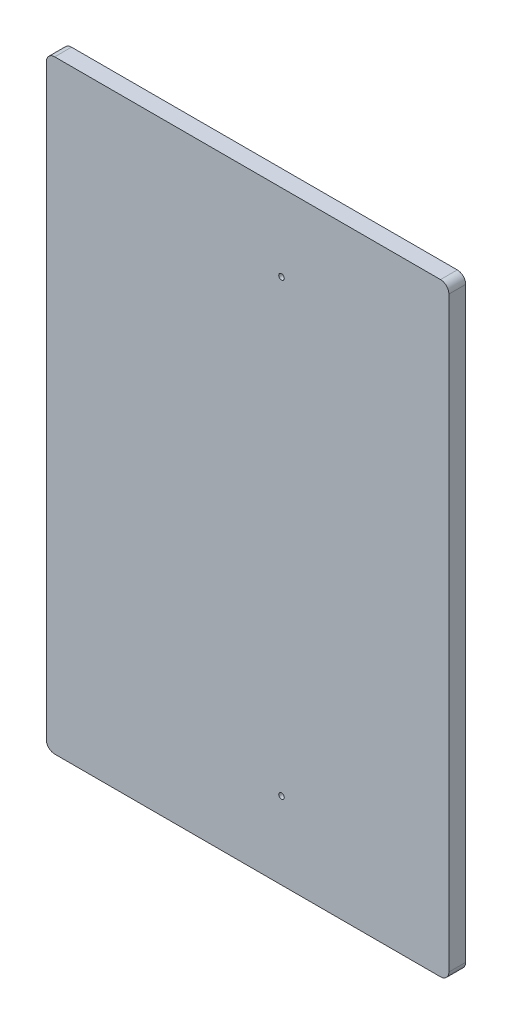
ISO-10303-21;
HEADER;
FILE_DESCRIPTION(('STEP AP214'),'2;1');
FILE_NAME('part.step','',(''),(''),'','','');
FILE_SCHEMA(('AUTOMOTIVE_DESIGN { 1 0 10303 214 1 1 1 1 }'));
ENDSEC;
DATA;
#1=APPLICATION_CONTEXT('core data for automotive mechanical design processes');
#2=APPLICATION_PROTOCOL_DEFINITION('international standard','automotive_design',2000,#1);
#3=PRODUCT_CONTEXT('',#1,'mechanical');
#4=PRODUCT('Part','Part','',(#3));
#5=PRODUCT_RELATED_PRODUCT_CATEGORY('part','',(#4));
#6=PRODUCT_DEFINITION_FORMATION('','',#4);
#7=PRODUCT_DEFINITION_CONTEXT('part definition',#1,'design');
#8=PRODUCT_DEFINITION('design','',#6,#7);
#9=PRODUCT_DEFINITION_SHAPE('','',#8);
#10=(LENGTH_UNIT() NAMED_UNIT(*) SI_UNIT(.MILLI.,.METRE.));
#11=(NAMED_UNIT(*) PLANE_ANGLE_UNIT() SI_UNIT($,.RADIAN.));
#12=(NAMED_UNIT(*) SI_UNIT($,.STERADIAN.) SOLID_ANGLE_UNIT());
#13=UNCERTAINTY_MEASURE_WITH_UNIT(LENGTH_MEASURE(1.E-05),#10,'distance_accuracy_value','');
#14=(GEOMETRIC_REPRESENTATION_CONTEXT(3) GLOBAL_UNCERTAINTY_ASSIGNED_CONTEXT((#13)) GLOBAL_UNIT_ASSIGNED_CONTEXT((#10,
#11,#12)) REPRESENTATION_CONTEXT('',''));
#15=CARTESIAN_POINT('',(0.,0.,0.));
#16=DIRECTION('',(0.,0.,1.));
#17=DIRECTION('',(1.,0.,0.));
#18=AXIS2_PLACEMENT_3D('',#15,#16,#17);
#19=CARTESIAN_POINT('',(152.4,19.05,12.7));
#20=DIRECTION('',(-1.,0.,0.));
#21=DIRECTION('',(0.,-1.,0.));
#22=AXIS2_PLACEMENT_3D('',#19,#20,#21);
#23=PLANE('',#22);
#24=DIRECTION('',(0.,1.,0.));
#25=VECTOR('',#24,1.);
#26=CARTESIAN_POINT('',(152.4,19.05,0.));
#27=LINE('',#26,#25);
#28=CARTESIAN_POINT('',(152.4,-431.8,0.));
#29=VERTEX_POINT('',#28);
#30=CARTESIAN_POINT('',(152.4,12.7,0.));
#31=VERTEX_POINT('',#30);
#32=EDGE_CURVE('E126',#29,#31,#27,.T.);
#33=ORIENTED_EDGE('',*,*,#32,.T.);
#34=DIRECTION('',(0.,0.,-1.));
#35=VECTOR('',#34,1.);
#36=CARTESIAN_POINT('',(152.4,12.7,12.7));
#37=LINE('',#36,#35);
#38=CARTESIAN_POINT('',(152.4,12.7,12.7));
#39=VERTEX_POINT('',#38);
#40=EDGE_CURVE('E104',#31,#39,#37,.F.);
#41=ORIENTED_EDGE('',*,*,#40,.T.);
#42=DIRECTION('',(0.,1.,0.));
#43=VECTOR('',#42,1.);
#44=CARTESIAN_POINT('',(152.4,19.05,12.7));
#45=LINE('',#44,#43);
#46=CARTESIAN_POINT('',(152.4,-431.8,12.7));
#47=VERTEX_POINT('',#46);
#48=EDGE_CURVE('E136',#47,#39,#45,.T.);
#49=ORIENTED_EDGE('',*,*,#48,.F.);
#50=DIRECTION('',(0.,0.,-1.));
#51=VECTOR('',#50,1.);
#52=CARTESIAN_POINT('',(152.4,-431.8,12.7));
#53=LINE('',#52,#51);
#54=EDGE_CURVE('E109',#47,#29,#53,.T.);
#55=ORIENTED_EDGE('',*,*,#54,.T.);
#56=EDGE_LOOP('',(#33,#41,#49,#55));
#57=FACE_BOUND('',#56,.T.);
#58=ADVANCED_FACE('F33',(#57),#23,.F.);
#59=CARTESIAN_POINT('',(152.4,19.05,12.7));
#60=DIRECTION('',(0.,-1.,0.));
#61=DIRECTION('',(1.,0.,0.));
#62=AXIS2_PLACEMENT_3D('',#59,#60,#61);
#63=PLANE('',#62);
#64=DIRECTION('',(-1.,0.,0.));
#65=VECTOR('',#64,1.);
#66=CARTESIAN_POINT('',(152.4,19.05,12.7));
#67=LINE('',#66,#65);
#68=CARTESIAN_POINT('',(146.05,19.05,12.7));
#69=VERTEX_POINT('',#68);
#70=CARTESIAN_POINT('',(-146.05,19.0499999999999,12.7));
#71=VERTEX_POINT('',#70);
#72=EDGE_CURVE('E119',#69,#71,#67,.T.);
#73=ORIENTED_EDGE('',*,*,#72,.F.);
#74=DIRECTION('',(0.,0.,-1.));
#75=VECTOR('',#74,1.);
#76=CARTESIAN_POINT('',(146.05,19.05,12.7));
#77=LINE('',#76,#75);
#78=CARTESIAN_POINT('',(146.05,19.05,0.));
#79=VERTEX_POINT('',#78);
#80=EDGE_CURVE('E103',#69,#79,#77,.T.);
#81=ORIENTED_EDGE('',*,*,#80,.T.);
#82=DIRECTION('',(-1.,0.,0.));
#83=VECTOR('',#82,1.);
#84=CARTESIAN_POINT('',(152.4,19.05,0.));
#85=LINE('',#84,#83);
#86=CARTESIAN_POINT('',(-146.05,19.0499999999999,0.));
#87=VERTEX_POINT('',#86);
#88=EDGE_CURVE('E116',#79,#87,#85,.T.);
#89=ORIENTED_EDGE('',*,*,#88,.T.);
#90=DIRECTION('',(0.,0.,-1.));
#91=VECTOR('',#90,1.);
#92=CARTESIAN_POINT('',(-146.05,19.0499999999999,12.7));
#93=LINE('',#92,#91);
#94=EDGE_CURVE('E121',#87,#71,#93,.F.);
#95=ORIENTED_EDGE('',*,*,#94,.T.);
#96=EDGE_LOOP('',(#73,#81,#89,#95));
#97=FACE_BOUND('',#96,.T.);
#98=ADVANCED_FACE('F115',(#97),#63,.F.);
#99=CARTESIAN_POINT('',(-152.4,19.0499999999999,12.7));
#100=DIRECTION('',(1.,0.,0.));
#101=DIRECTION('',(0.,1.,0.));
#102=AXIS2_PLACEMENT_3D('',#99,#100,#101);
#103=PLANE('',#102);
#104=DIRECTION('',(0.,-1.,0.));
#105=VECTOR('',#104,1.);
#106=CARTESIAN_POINT('',(-152.4,19.0499999999999,0.));
#107=LINE('',#106,#105);
#108=CARTESIAN_POINT('',(-152.4,12.6999999999999,0.));
#109=VERTEX_POINT('',#108);
#110=CARTESIAN_POINT('',(-152.4,-431.8,0.));
#111=VERTEX_POINT('',#110);
#112=EDGE_CURVE('E125',#109,#111,#107,.T.);
#113=ORIENTED_EDGE('',*,*,#112,.T.);
#114=DIRECTION('',(0.,0.,-1.));
#115=VECTOR('',#114,1.);
#116=CARTESIAN_POINT('',(-152.4,-431.8,12.7));
#117=LINE('',#116,#115);
#118=CARTESIAN_POINT('',(-152.4,-431.8,12.7));
#119=VERTEX_POINT('',#118);
#120=EDGE_CURVE('E11',#111,#119,#117,.F.);
#121=ORIENTED_EDGE('',*,*,#120,.T.);
#122=DIRECTION('',(0.,-1.,0.));
#123=VECTOR('',#122,1.);
#124=CARTESIAN_POINT('',(-152.4,19.0499999999999,12.7));
#125=LINE('',#124,#123);
#126=CARTESIAN_POINT('',(-152.4,12.6999999999999,12.7));
#127=VERTEX_POINT('',#126);
#128=EDGE_CURVE('E162',#127,#119,#125,.T.);
#129=ORIENTED_EDGE('',*,*,#128,.F.);
#130=DIRECTION('',(0.,0.,-1.));
#131=VECTOR('',#130,1.);
#132=CARTESIAN_POINT('',(-152.4,12.6999999999999,12.7));
#133=LINE('',#132,#131);
#134=EDGE_CURVE('E41',#127,#109,#133,.T.);
#135=ORIENTED_EDGE('',*,*,#134,.T.);
#136=EDGE_LOOP('',(#113,#121,#129,#135));
#137=FACE_BOUND('',#136,.T.);
#138=ADVANCED_FACE('F160',(#137),#103,.F.);
#139=CARTESIAN_POINT('',(152.4,-438.15,12.7));
#140=DIRECTION('',(0.,1.,0.));
#141=DIRECTION('',(0.,0.,1.));
#142=AXIS2_PLACEMENT_3D('',#139,#140,#141);
#143=PLANE('',#142);
#144=DIRECTION('',(1.,0.,0.));
#145=VECTOR('',#144,1.);
#146=CARTESIAN_POINT('',(152.4,-438.15,0.));
#147=LINE('',#146,#145);
#148=CARTESIAN_POINT('',(-146.05,-438.15,0.));
#149=VERTEX_POINT('',#148);
#150=CARTESIAN_POINT('',(146.05,-438.15,0.));
#151=VERTEX_POINT('',#150);
#152=EDGE_CURVE('E129',#149,#151,#147,.T.);
#153=ORIENTED_EDGE('',*,*,#152,.T.);
#154=DIRECTION('',(0.,0.,-1.));
#155=VECTOR('',#154,1.);
#156=CARTESIAN_POINT('',(146.05,-438.15,12.7));
#157=LINE('',#156,#155);
#158=CARTESIAN_POINT('',(146.05,-438.15,12.7));
#159=VERTEX_POINT('',#158);
#160=EDGE_CURVE('E48',#151,#159,#157,.F.);
#161=ORIENTED_EDGE('',*,*,#160,.T.);
#162=DIRECTION('',(1.,0.,0.));
#163=VECTOR('',#162,1.);
#164=CARTESIAN_POINT('',(152.4,-438.15,12.7));
#165=LINE('',#164,#163);
#166=CARTESIAN_POINT('',(-146.05,-438.15,12.7));
#167=VERTEX_POINT('',#166);
#168=EDGE_CURVE('E137',#167,#159,#165,.T.);
#169=ORIENTED_EDGE('',*,*,#168,.F.);
#170=DIRECTION('',(0.,0.,-1.));
#171=VECTOR('',#170,1.);
#172=CARTESIAN_POINT('',(-146.05,-438.15,12.7));
#173=LINE('',#172,#171);
#174=EDGE_CURVE('E153',#167,#149,#173,.T.);
#175=ORIENTED_EDGE('',*,*,#174,.T.);
#176=EDGE_LOOP('',(#153,#161,#169,#175));
#177=FACE_BOUND('',#176,.T.);
#178=ADVANCED_FACE('F169',(#177),#143,.F.);
#179=CARTESIAN_POINT('',(152.4,-438.15,12.7));
#180=DIRECTION('',(0.,0.,-1.));
#181=DIRECTION('',(-1.,0.,0.));
#182=AXIS2_PLACEMENT_3D('',#179,#180,#181);
#183=PLANE('',#182);
#184=CARTESIAN_POINT('',(25.6540000000001,-379.73,12.7));
#185=DIRECTION('',(0.,0.,-1.));
#186=DIRECTION('',(1.,0.,0.));
#187=AXIS2_PLACEMENT_3D('',#184,#185,#186);
#188=CIRCLE('',#187,2.09550000000001);
#189=CARTESIAN_POINT('',(27.7495000000001,-379.73,12.7));
#190=VERTEX_POINT('',#189);
#191=EDGE_CURVE('E179',#190,#190,#188,.T.);
#192=ORIENTED_EDGE('',*,*,#191,.T.);
#193=EDGE_LOOP('',(#192));
#194=FACE_BOUND('',#193,.T.);
#195=CARTESIAN_POINT('',(25.654,-39.3699999999999,12.7));
#196=DIRECTION('',(0.,0.,-1.));
#197=DIRECTION('',(-1.,0.,0.));
#198=AXIS2_PLACEMENT_3D('',#195,#196,#197);
#199=CIRCLE('',#198,2.0955);
#200=CARTESIAN_POINT('',(23.5585,-39.3699999999999,12.7));
#201=VERTEX_POINT('',#200);
#202=EDGE_CURVE('E131',#201,#201,#199,.T.);
#203=ORIENTED_EDGE('',*,*,#202,.T.);
#204=EDGE_LOOP('',(#203));
#205=FACE_BOUND('',#204,.T.);
#206=ORIENTED_EDGE('',*,*,#48,.T.);
#207=CARTESIAN_POINT('',(146.05,12.7,12.7));
#208=DIRECTION('',(0.,0.,-1.));
#209=DIRECTION('',(-1.,0.,0.));
#210=AXIS2_PLACEMENT_3D('',#207,#208,#209);
#211=CIRCLE('',#210,6.35);
#212=EDGE_CURVE('E151',#39,#69,#211,.F.);
#213=ORIENTED_EDGE('',*,*,#212,.T.);
#214=ORIENTED_EDGE('',*,*,#72,.T.);
#215=CARTESIAN_POINT('',(-146.05,12.6999999999999,12.7));
#216=DIRECTION('',(0.,0.,-1.));
#217=DIRECTION('',(-1.,0.,0.));
#218=AXIS2_PLACEMENT_3D('',#215,#216,#217);
#219=CIRCLE('',#218,6.35);
#220=EDGE_CURVE('E146',#71,#127,#219,.F.);
#221=ORIENTED_EDGE('',*,*,#220,.T.);
#222=ORIENTED_EDGE('',*,*,#128,.T.);
#223=CARTESIAN_POINT('',(-146.05,-431.8,12.7));
#224=DIRECTION('',(0.,0.,-1.));
#225=DIRECTION('',(-1.,0.,0.));
#226=AXIS2_PLACEMENT_3D('',#223,#224,#225);
#227=CIRCLE('',#226,6.35);
#228=EDGE_CURVE('E55',#119,#167,#227,.F.);
#229=ORIENTED_EDGE('',*,*,#228,.T.);
#230=ORIENTED_EDGE('',*,*,#168,.T.);
#231=CARTESIAN_POINT('',(146.05,-431.8,12.7));
#232=DIRECTION('',(0.,0.,-1.));
#233=DIRECTION('',(-1.,0.,0.));
#234=AXIS2_PLACEMENT_3D('',#231,#232,#233);
#235=CIRCLE('',#234,6.35);
#236=EDGE_CURVE('E149',#159,#47,#235,.F.);
#237=ORIENTED_EDGE('',*,*,#236,.T.);
#238=EDGE_LOOP('',(#206,#213,#214,#221,#222,#229,#230,#237));
#239=FACE_BOUND('',#238,.T.);
#240=ADVANCED_FACE('F188',(#194,#205,#239),#183,.F.);
#241=CARTESIAN_POINT('',(152.4,-438.15,0.));
#242=DIRECTION('',(0.,0.,-1.));
#243=DIRECTION('',(-1.,0.,0.));
#244=AXIS2_PLACEMENT_3D('',#241,#242,#243);
#245=PLANE('',#244);
#246=CARTESIAN_POINT('',(25.6540000000001,-379.73,0.));
#247=DIRECTION('',(0.,0.,-1.));
#248=DIRECTION('',(1.,0.,0.));
#249=AXIS2_PLACEMENT_3D('',#246,#247,#248);
#250=CIRCLE('',#249,2.09550000000001);
#251=CARTESIAN_POINT('',(27.7495000000001,-379.73,0.));
#252=VERTEX_POINT('',#251);
#253=EDGE_CURVE('E182',#252,#252,#250,.T.);
#254=ORIENTED_EDGE('',*,*,#253,.F.);
#255=EDGE_LOOP('',(#254));
#256=FACE_BOUND('',#255,.T.);
#257=CARTESIAN_POINT('',(25.654,-39.3699999999999,0.));
#258=DIRECTION('',(0.,0.,-1.));
#259=DIRECTION('',(-1.,0.,0.));
#260=AXIS2_PLACEMENT_3D('',#257,#258,#259);
#261=CIRCLE('',#260,2.0955);
#262=CARTESIAN_POINT('',(23.5585,-39.3699999999999,0.));
#263=VERTEX_POINT('',#262);
#264=EDGE_CURVE('E176',#263,#263,#261,.T.);
#265=ORIENTED_EDGE('',*,*,#264,.F.);
#266=EDGE_LOOP('',(#265));
#267=FACE_BOUND('',#266,.T.);
#268=ORIENTED_EDGE('',*,*,#88,.F.);
#269=CARTESIAN_POINT('',(146.05,12.7,0.));
#270=DIRECTION('',(0.,0.,-1.));
#271=DIRECTION('',(-1.,0.,0.));
#272=AXIS2_PLACEMENT_3D('',#269,#270,#271);
#273=CIRCLE('',#272,6.35);
#274=EDGE_CURVE('E99',#79,#31,#273,.T.);
#275=ORIENTED_EDGE('',*,*,#274,.T.);
#276=ORIENTED_EDGE('',*,*,#32,.F.);
#277=CARTESIAN_POINT('',(146.05,-431.8,0.));
#278=DIRECTION('',(0.,0.,-1.));
#279=DIRECTION('',(-1.,0.,0.));
#280=AXIS2_PLACEMENT_3D('',#277,#278,#279);
#281=CIRCLE('',#280,6.35);
#282=EDGE_CURVE('E110',#29,#151,#281,.T.);
#283=ORIENTED_EDGE('',*,*,#282,.T.);
#284=ORIENTED_EDGE('',*,*,#152,.F.);
#285=CARTESIAN_POINT('',(-146.05,-431.8,0.));
#286=DIRECTION('',(0.,0.,-1.));
#287=DIRECTION('',(-1.,0.,0.));
#288=AXIS2_PLACEMENT_3D('',#285,#286,#287);
#289=CIRCLE('',#288,6.35);
#290=EDGE_CURVE('E140',#149,#111,#289,.T.);
#291=ORIENTED_EDGE('',*,*,#290,.T.);
#292=ORIENTED_EDGE('',*,*,#112,.F.);
#293=CARTESIAN_POINT('',(-146.05,12.6999999999999,0.));
#294=DIRECTION('',(0.,0.,-1.));
#295=DIRECTION('',(-1.,0.,0.));
#296=AXIS2_PLACEMENT_3D('',#293,#294,#295);
#297=CIRCLE('',#296,6.35);
#298=EDGE_CURVE('E120',#109,#87,#297,.T.);
#299=ORIENTED_EDGE('',*,*,#298,.T.);
#300=EDGE_LOOP('',(#268,#275,#276,#283,#284,#291,#292,#299));
#301=FACE_BOUND('',#300,.T.);
#302=ADVANCED_FACE('F123',(#256,#267,#301),#245,.T.);
#303=CARTESIAN_POINT('',(146.05,12.7,12.7));
#304=DIRECTION('',(0.,0.,-1.));
#305=DIRECTION('',(-1.,0.,0.));
#306=AXIS2_PLACEMENT_3D('',#303,#304,#305);
#307=CYLINDRICAL_SURFACE('',#306,6.35);
#308=ORIENTED_EDGE('',*,*,#212,.F.);
#309=ORIENTED_EDGE('',*,*,#40,.F.);
#310=ORIENTED_EDGE('',*,*,#274,.F.);
#311=ORIENTED_EDGE('',*,*,#80,.F.);
#312=EDGE_LOOP('',(#308,#309,#310,#311));
#313=FACE_BOUND('',#312,.T.);
#314=ADVANCED_FACE('F102',(#313),#307,.T.);
#315=CARTESIAN_POINT('',(146.05,-431.8,12.7));
#316=DIRECTION('',(0.,0.,-1.));
#317=DIRECTION('',(-1.,0.,0.));
#318=AXIS2_PLACEMENT_3D('',#315,#316,#317);
#319=CYLINDRICAL_SURFACE('',#318,6.35);
#320=ORIENTED_EDGE('',*,*,#236,.F.);
#321=ORIENTED_EDGE('',*,*,#160,.F.);
#322=ORIENTED_EDGE('',*,*,#282,.F.);
#323=ORIENTED_EDGE('',*,*,#54,.F.);
#324=EDGE_LOOP('',(#320,#321,#322,#323));
#325=FACE_BOUND('',#324,.T.);
#326=ADVANCED_FACE('F222',(#325),#319,.T.);
#327=CARTESIAN_POINT('',(-146.05,-431.8,12.7));
#328=DIRECTION('',(0.,0.,-1.));
#329=DIRECTION('',(-1.,0.,0.));
#330=AXIS2_PLACEMENT_3D('',#327,#328,#329);
#331=CYLINDRICAL_SURFACE('',#330,6.35);
#332=ORIENTED_EDGE('',*,*,#228,.F.);
#333=ORIENTED_EDGE('',*,*,#120,.F.);
#334=ORIENTED_EDGE('',*,*,#290,.F.);
#335=ORIENTED_EDGE('',*,*,#174,.F.);
#336=EDGE_LOOP('',(#332,#333,#334,#335));
#337=FACE_BOUND('',#336,.T.);
#338=ADVANCED_FACE('F168',(#337),#331,.T.);
#339=CARTESIAN_POINT('',(-146.05,12.6999999999999,12.7));
#340=DIRECTION('',(0.,0.,-1.));
#341=DIRECTION('',(-1.,0.,0.));
#342=AXIS2_PLACEMENT_3D('',#339,#340,#341);
#343=CYLINDRICAL_SURFACE('',#342,6.35);
#344=ORIENTED_EDGE('',*,*,#220,.F.);
#345=ORIENTED_EDGE('',*,*,#94,.F.);
#346=ORIENTED_EDGE('',*,*,#298,.F.);
#347=ORIENTED_EDGE('',*,*,#134,.F.);
#348=EDGE_LOOP('',(#344,#345,#346,#347));
#349=FACE_BOUND('',#348,.T.);
#350=ADVANCED_FACE('F35',(#349),#343,.T.);
#351=CARTESIAN_POINT('',(25.654,-39.3699999999999,12.7));
#352=DIRECTION('',(0.,0.,-1.));
#353=DIRECTION('',(-1.,0.,0.));
#354=AXIS2_PLACEMENT_3D('',#351,#352,#353);
#355=CYLINDRICAL_SURFACE('',#354,2.0955);
#356=ORIENTED_EDGE('',*,*,#202,.F.);
#357=EDGE_LOOP('',(#356));
#358=FACE_BOUND('',#357,.T.);
#359=ORIENTED_EDGE('',*,*,#264,.T.);
#360=EDGE_LOOP('',(#359));
#361=FACE_BOUND('',#360,.T.);
#362=ADVANCED_FACE('F194',(#358,#361),#355,.F.);
#363=CARTESIAN_POINT('',(25.6540000000001,-379.73,12.7));
#364=DIRECTION('',(0.,0.,-1.));
#365=DIRECTION('',(-1.,0.,0.));
#366=AXIS2_PLACEMENT_3D('',#363,#364,#365);
#367=CYLINDRICAL_SURFACE('',#366,2.09550000000001);
#368=ORIENTED_EDGE('',*,*,#191,.F.);
#369=EDGE_LOOP('',(#368));
#370=FACE_BOUND('',#369,.T.);
#371=ORIENTED_EDGE('',*,*,#253,.T.);
#372=EDGE_LOOP('',(#371));
#373=FACE_BOUND('',#372,.T.);
#374=ADVANCED_FACE('F191',(#370,#373),#367,.F.);
#375=CLOSED_SHELL('',(#58,#98,#138,#178,#240,#302,#314,#326,#338,#350,#362,#374));
#376=MANIFOLD_SOLID_BREP('B2',#375);
#377=ADVANCED_BREP_SHAPE_REPRESENTATION('',(#18,#376),#14);
#378=SHAPE_DEFINITION_REPRESENTATION(#9,#377);
ENDSEC;
END-ISO-10303-21;
